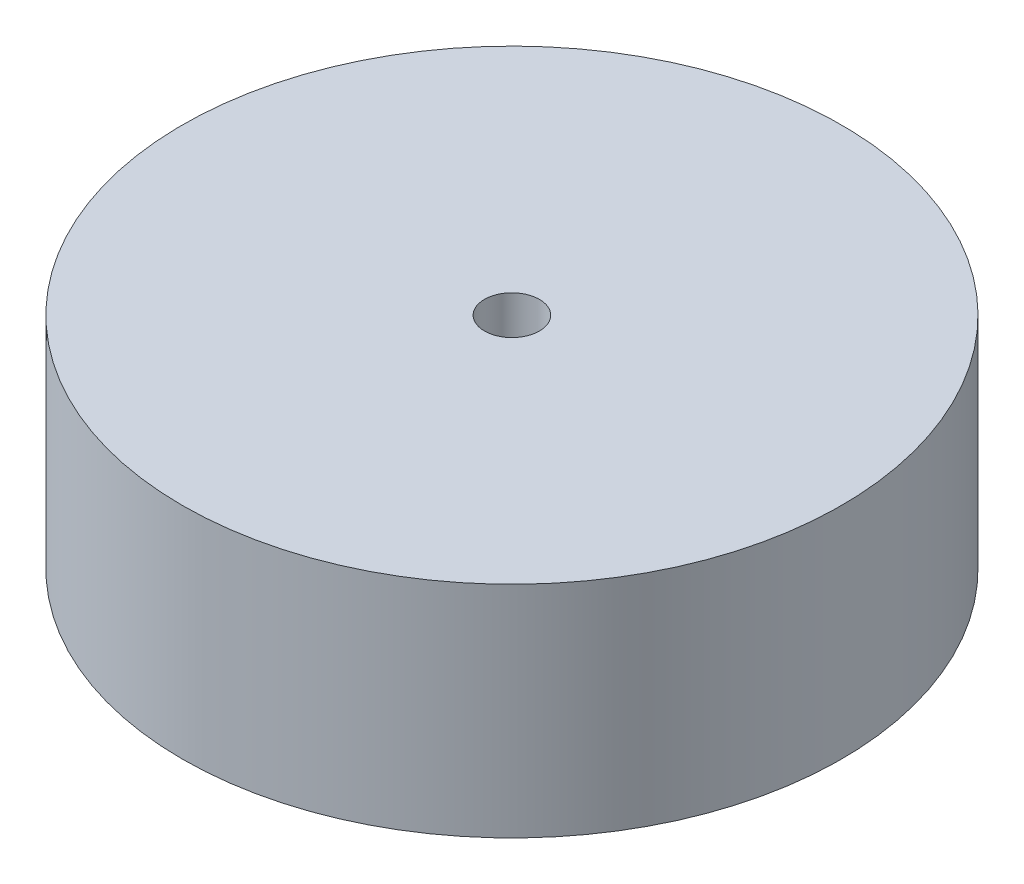
ISO-10303-21;
HEADER;
FILE_DESCRIPTION(('STEP AP214'),'2;1');
FILE_NAME('part.step','',(''),(''),'','','');
FILE_SCHEMA(('AUTOMOTIVE_DESIGN { 1 0 10303 214 1 1 1 1 }'));
ENDSEC;
DATA;
#1=APPLICATION_CONTEXT('core data for automotive mechanical design processes');
#2=APPLICATION_PROTOCOL_DEFINITION('international standard','automotive_design',2000,#1);
#3=PRODUCT_CONTEXT('',#1,'mechanical');
#4=PRODUCT('Part','Part','',(#3));
#5=PRODUCT_RELATED_PRODUCT_CATEGORY('part','',(#4));
#6=PRODUCT_DEFINITION_FORMATION('','',#4);
#7=PRODUCT_DEFINITION_CONTEXT('part definition',#1,'design');
#8=PRODUCT_DEFINITION('design','',#6,#7);
#9=PRODUCT_DEFINITION_SHAPE('','',#8);
#10=(LENGTH_UNIT() NAMED_UNIT(*) SI_UNIT(.MILLI.,.METRE.));
#11=(NAMED_UNIT(*) PLANE_ANGLE_UNIT() SI_UNIT($,.RADIAN.));
#12=(NAMED_UNIT(*) SI_UNIT($,.STERADIAN.) SOLID_ANGLE_UNIT());
#13=UNCERTAINTY_MEASURE_WITH_UNIT(LENGTH_MEASURE(1.E-05),#10,'distance_accuracy_value','');
#14=(GEOMETRIC_REPRESENTATION_CONTEXT(3) GLOBAL_UNCERTAINTY_ASSIGNED_CONTEXT((#13)) GLOBAL_UNIT_ASSIGNED_CONTEXT((#10,
#11,#12)) REPRESENTATION_CONTEXT('',''));
#15=CARTESIAN_POINT('',(0.,0.,0.));
#16=DIRECTION('',(0.,0.,1.));
#17=DIRECTION('',(1.,0.,0.));
#18=AXIS2_PLACEMENT_3D('',#15,#16,#17);
#19=CARTESIAN_POINT('',(0.,25.4,0.));
#20=DIRECTION('',(0.,1.,0.));
#21=DIRECTION('',(0.,0.,1.));
#22=AXIS2_PLACEMENT_3D('',#19,#20,#21);
#23=PLANE('',#22);
#24=CARTESIAN_POINT('',(0.,25.4,0.));
#25=DIRECTION('',(0.,1.,0.));
#26=DIRECTION('',(0.,0.,1.));
#27=AXIS2_PLACEMENT_3D('',#24,#25,#26);
#28=CIRCLE('',#27,38.1);
#29=CARTESIAN_POINT('',(0.,25.4,38.1));
#30=VERTEX_POINT('',#29);
#31=EDGE_CURVE('E10',#30,#30,#28,.T.);
#32=ORIENTED_EDGE('',*,*,#31,.T.);
#33=EDGE_LOOP('',(#32));
#34=FACE_BOUND('',#33,.T.);
#35=CARTESIAN_POINT('',(0.,25.4,0.));
#36=DIRECTION('',(0.,1.,0.));
#37=DIRECTION('',(0.,0.,1.));
#38=AXIS2_PLACEMENT_3D('',#35,#36,#37);
#39=CIRCLE('',#38,3.175);
#40=CARTESIAN_POINT('',(0.,25.4,3.175));
#41=VERTEX_POINT('',#40);
#42=EDGE_CURVE('E42',#41,#41,#39,.T.);
#43=ORIENTED_EDGE('',*,*,#42,.F.);
#44=EDGE_LOOP('',(#43));
#45=FACE_BOUND('',#44,.T.);
#46=ADVANCED_FACE('F31',(#34,#45),#23,.T.);
#47=CARTESIAN_POINT('',(0.,0.,0.));
#48=DIRECTION('',(0.,1.,0.));
#49=DIRECTION('',(0.,0.,1.));
#50=AXIS2_PLACEMENT_3D('',#47,#48,#49);
#51=PLANE('',#50);
#52=CARTESIAN_POINT('',(0.,0.,0.));
#53=DIRECTION('',(0.,1.,0.));
#54=DIRECTION('',(0.,0.,1.));
#55=AXIS2_PLACEMENT_3D('',#52,#53,#54);
#56=CIRCLE('',#55,38.1);
#57=CARTESIAN_POINT('',(0.,0.,38.1));
#58=VERTEX_POINT('',#57);
#59=EDGE_CURVE('E35',#58,#58,#56,.T.);
#60=ORIENTED_EDGE('',*,*,#59,.F.);
#61=EDGE_LOOP('',(#60));
#62=FACE_BOUND('',#61,.T.);
#63=CARTESIAN_POINT('',(0.,0.,0.));
#64=DIRECTION('',(0.,1.,0.));
#65=DIRECTION('',(0.,0.,1.));
#66=AXIS2_PLACEMENT_3D('',#63,#64,#65);
#67=CIRCLE('',#66,3.175);
#68=CARTESIAN_POINT('',(0.,0.,3.175));
#69=VERTEX_POINT('',#68);
#70=EDGE_CURVE('E44',#69,#69,#67,.T.);
#71=ORIENTED_EDGE('',*,*,#70,.T.);
#72=EDGE_LOOP('',(#71));
#73=FACE_BOUND('',#72,.T.);
#74=ADVANCED_FACE('F54',(#62,#73),#51,.F.);
#75=CARTESIAN_POINT('',(0.,25.4,0.));
#76=DIRECTION('',(0.,-1.,0.));
#77=DIRECTION('',(0.,0.,-1.));
#78=AXIS2_PLACEMENT_3D('',#75,#76,#77);
#79=CYLINDRICAL_SURFACE('',#78,38.1);
#80=ORIENTED_EDGE('',*,*,#31,.F.);
#81=EDGE_LOOP('',(#80));
#82=FACE_BOUND('',#81,.T.);
#83=ORIENTED_EDGE('',*,*,#59,.T.);
#84=EDGE_LOOP('',(#83));
#85=FACE_BOUND('',#84,.T.);
#86=ADVANCED_FACE('F33',(#82,#85),#79,.T.);
#87=CARTESIAN_POINT('',(0.,25.4,0.));
#88=DIRECTION('',(0.,-1.,0.));
#89=DIRECTION('',(0.,0.,-1.));
#90=AXIS2_PLACEMENT_3D('',#87,#88,#89);
#91=CYLINDRICAL_SURFACE('',#90,3.175);
#92=ORIENTED_EDGE('',*,*,#42,.T.);
#93=EDGE_LOOP('',(#92));
#94=FACE_BOUND('',#93,.T.);
#95=ORIENTED_EDGE('',*,*,#70,.F.);
#96=EDGE_LOOP('',(#95));
#97=FACE_BOUND('',#96,.T.);
#98=ADVANCED_FACE('F50',(#94,#97),#91,.F.);
#99=CLOSED_SHELL('',(#46,#74,#86,#98));
#100=MANIFOLD_SOLID_BREP('B2',#99);
#101=ADVANCED_BREP_SHAPE_REPRESENTATION('',(#18,#100),#14);
#102=SHAPE_DEFINITION_REPRESENTATION(#9,#101);
ENDSEC;
END-ISO-10303-21;
